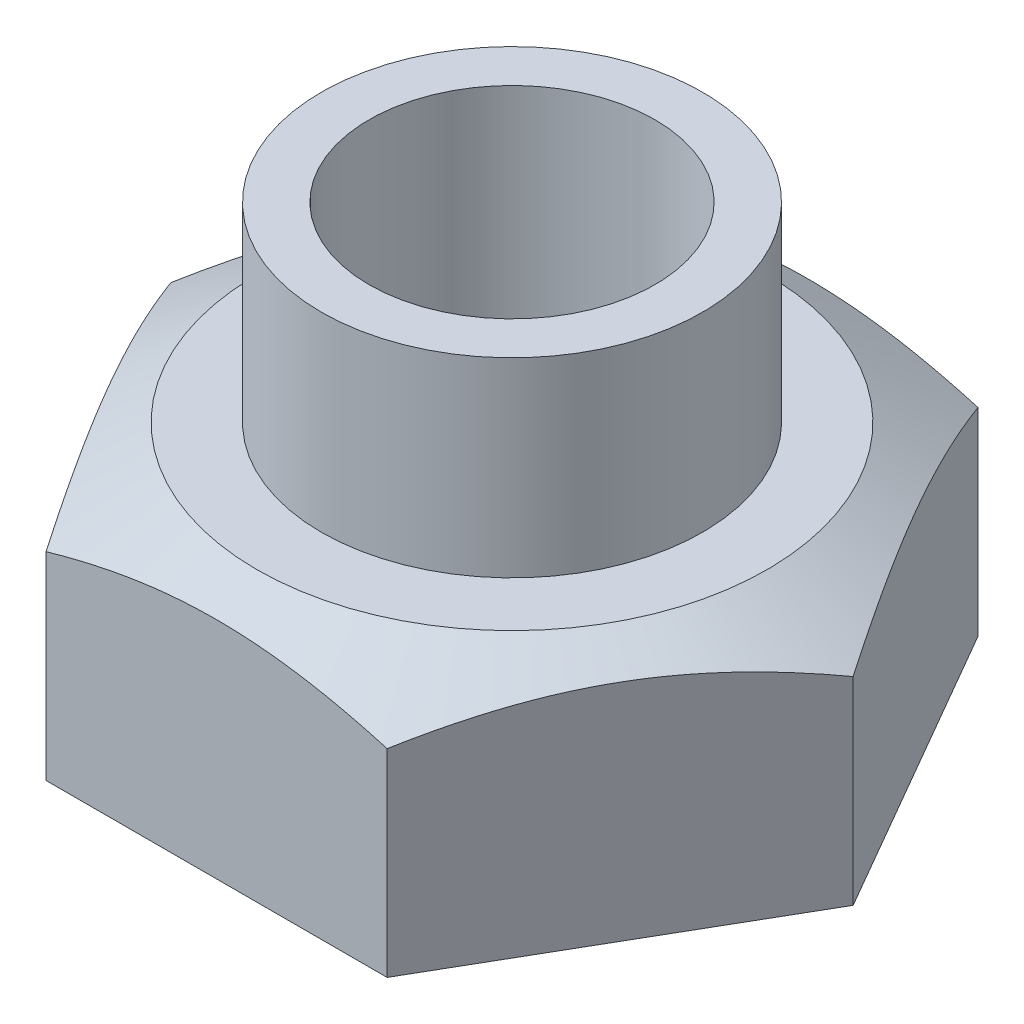
ISO-10303-21;
HEADER;
FILE_DESCRIPTION(('STEP AP214'),'2;1');
FILE_NAME('part.step','',(''),(''),'','','');
FILE_SCHEMA(('AUTOMOTIVE_DESIGN { 1 0 10303 214 1 1 1 1 }'));
ENDSEC;
DATA;
#1=APPLICATION_CONTEXT('core data for automotive mechanical design processes');
#2=APPLICATION_PROTOCOL_DEFINITION('international standard','automotive_design',2000,#1);
#3=PRODUCT_CONTEXT('',#1,'mechanical');
#4=PRODUCT('Part','Part','',(#3));
#5=PRODUCT_RELATED_PRODUCT_CATEGORY('part','',(#4));
#6=PRODUCT_DEFINITION_FORMATION('','',#4);
#7=PRODUCT_DEFINITION_CONTEXT('part definition',#1,'design');
#8=PRODUCT_DEFINITION('design','',#6,#7);
#9=PRODUCT_DEFINITION_SHAPE('','',#8);
#10=(LENGTH_UNIT() NAMED_UNIT(*) SI_UNIT(.MILLI.,.METRE.));
#11=(NAMED_UNIT(*) PLANE_ANGLE_UNIT() SI_UNIT($,.RADIAN.));
#12=(NAMED_UNIT(*) SI_UNIT($,.STERADIAN.) SOLID_ANGLE_UNIT());
#13=UNCERTAINTY_MEASURE_WITH_UNIT(LENGTH_MEASURE(1.E-05),#10,'distance_accuracy_value','');
#14=(GEOMETRIC_REPRESENTATION_CONTEXT(3) GLOBAL_UNCERTAINTY_ASSIGNED_CONTEXT((#13)) GLOBAL_UNIT_ASSIGNED_CONTEXT((#10,
#11,#12)) REPRESENTATION_CONTEXT('',''));
#15=CARTESIAN_POINT('',(0.,0.,0.));
#16=DIRECTION('',(0.,0.,1.));
#17=DIRECTION('',(1.,0.,0.));
#18=AXIS2_PLACEMENT_3D('',#15,#16,#17);
#19=CARTESIAN_POINT('',(-44.744645862196,65.,77.5));
#20=DIRECTION('',(0.,0.,-1.));
#21=DIRECTION('',(-1.,0.,0.));
#22=AXIS2_PLACEMENT_3D('',#19,#20,#21);
#23=PLANE('',#22);
#24=CARTESIAN_POINT('',(-135.175651929084,13.6908332039156,77.5000000000001));
#25=CARTESIAN_POINT('',(-133.560064455864,14.5000187647562,77.5000000000001));
#26=CARTESIAN_POINT('',(-131.943048344693,15.3063579091028,77.5000000000001));
#27=CARTESIAN_POINT('',(-128.705893505913,16.912761227417,77.5000000000001));
#28=CARTESIAN_POINT('',(-127.08575476411,17.7128253727757,77.5000000000001));
#29=CARTESIAN_POINT('',(-123.841998515401,19.3061410048761,77.5000000000001));
#30=CARTESIAN_POINT('',(-122.218380789003,20.0993920449549,77.5000000000001));
#31=CARTESIAN_POINT('',(-118.967481978106,21.6783498272248,77.5000000000001));
#32=CARTESIAN_POINT('',(-117.340200897506,22.4640565774408,77.5000000000001));
#33=CARTESIAN_POINT('',(-114.0783935173,24.0287316707314,77.5000000000001));
#34=CARTESIAN_POINT('',(-112.443859235362,24.8076833804559,77.5));
#35=CARTESIAN_POINT('',(-109.170437915647,26.3563854623794,77.5));
#36=CARTESIAN_POINT('',(-107.531550883413,27.1261358462869,77.5));
#37=CARTESIAN_POINT('',(-104.249056159087,28.6554461420733,77.5));
#38=CARTESIAN_POINT('',(-102.605448537514,29.415006205229,77.5));
#39=CARTESIAN_POINT('',(-99.3130662114841,30.9228328783578,77.5));
#40=CARTESIAN_POINT('',(-97.6642915276657,31.6710995333707,77.5));
#41=CARTESIAN_POINT('',(-94.2862875805359,33.1886886778208,77.5));
#42=CARTESIAN_POINT('',(-92.5567968571205,33.957429690621,77.5));
#43=CARTESIAN_POINT('',(-89.0910598584537,35.4795470348528,77.5));
#44=CARTESIAN_POINT('',(-87.3548135776388,36.2329233536274,77.5));
#45=CARTESIAN_POINT('',(-83.8748380334898,37.7224544301031,77.5));
#46=CARTESIAN_POINT('',(-82.1311083967432,38.4586083163128,77.5));
#47=CARTESIAN_POINT('',(-78.6355633497624,39.9114782114981,77.5));
#48=CARTESIAN_POINT('',(-76.8837479512098,40.6281942485456,77.5));
#49=CARTESIAN_POINT('',(-73.3723631776861,42.0392581332478,77.5));
#50=CARTESIAN_POINT('',(-71.612799199212,42.7336193907867,77.5));
#51=CARTESIAN_POINT('',(-68.0840686605693,44.0975722954334,77.5));
#52=CARTESIAN_POINT('',(-66.3149020369656,44.7671637786835,77.5));
#53=CARTESIAN_POINT('',(-62.7663356227915,46.0782392756286,77.5));
#54=CARTESIAN_POINT('',(-60.9869367296779,46.7197257130881,77.5));
#55=CARTESIAN_POINT('',(-57.4170228677282,47.9708971580574,77.5));
#56=CARTESIAN_POINT('',(-55.6265081481319,48.580582875744,77.5));
#57=CARTESIAN_POINT('',(-51.6174983759592,49.9010043216298,77.5));
#58=CARTESIAN_POINT('',(-49.3959229298081,50.6024409205918,77.5));
#59=CARTESIAN_POINT('',(-44.9336394361458,51.9417869132311,77.5));
#60=CARTESIAN_POINT('',(-42.6929315283788,52.5796967704793,77.5));
#61=CARTESIAN_POINT('',(-38.1917581668546,53.7819624755312,77.5));
#62=CARTESIAN_POINT('',(-35.931292814605,54.3463187009936,77.5));
#63=CARTESIAN_POINT('',(-31.3908544083925,55.3906404868562,77.5));
#64=CARTESIAN_POINT('',(-29.1108814633232,55.8706065180108,77.5));
#65=CARTESIAN_POINT('',(-24.5716297182263,56.7277080753905,77.5));
#66=CARTESIAN_POINT('',(-22.3126590865374,57.1064546172813,77.5));
#67=CARTESIAN_POINT('',(-18.9132238845838,57.597963620405,77.5));
#68=CARTESIAN_POINT('',(-17.7782101825745,57.7490353185732,77.5));
#69=CARTESIAN_POINT('',(-15.5049704306437,58.0245744977216,77.5));
#70=CARTESIAN_POINT('',(-14.366744486752,58.1490428466566,77.5));
#71=CARTESIAN_POINT('',(-12.0879944179053,58.3703867933363,77.5));
#72=CARTESIAN_POINT('',(-10.9474711864051,58.4672715831577,77.5));
#73=CARTESIAN_POINT('',(-8.66436744615596,58.6327347497053,77.5));
#74=CARTESIAN_POINT('',(-7.52178693845105,58.7013131407936,77.5));
#75=CARTESIAN_POINT('',(-5.23525786079968,58.8095980305361,77.5));
#76=CARTESIAN_POINT('',(-4.09130929383261,58.8493045919536,77.5));
#77=CARTESIAN_POINT('',(-1.80276948947445,58.899511966885,77.5));
#78=CARTESIAN_POINT('',(-0.658178251883595,58.9100127713156,77.5));
#79=CARTESIAN_POINT('',(1.63807914160998,58.9016930074525,77.5));
#80=CARTESIAN_POINT('',(2.78974463197028,58.8826880677743,77.5));
#81=CARTESIAN_POINT('',(5.09220871788416,58.8151773976856,77.5));
#82=CARTESIAN_POINT('',(6.24300731294915,58.7666716506609,77.5));
#83=CARTESIAN_POINT('',(8.54301198835419,58.640570279756,77.5));
#84=CARTESIAN_POINT('',(9.69221806016888,58.5629745007451,77.5));
#85=CARTESIAN_POINT('',(11.9883483756476,58.379335025393,77.5));
#86=CARTESIAN_POINT('',(13.1352726185764,58.2732913198871,77.5));
#87=CARTESIAN_POINT('',(15.4266420746052,58.0335549597962,77.5));
#88=CARTESIAN_POINT('',(16.5710862487641,57.8998523832834,77.5));
#89=CARTESIAN_POINT('',(18.8565644081301,57.6058410730192,77.5));
#90=CARTESIAN_POINT('',(19.9975982807852,57.4455314708018,77.5));
#91=CARTESIAN_POINT('',(23.4148224380505,56.9263956601425,77.5));
#92=CARTESIAN_POINT('',(25.6852916356814,56.5293458005397,77.5));
#93=CARTESIAN_POINT('',(30.2472874041784,55.6359044954879,77.5));
#94=CARTESIAN_POINT('',(32.5384957742367,55.1379088700891,77.5));
#95=CARTESIAN_POINT('',(37.1010436949541,54.058360804766,77.5));
#96=CARTESIAN_POINT('',(39.3723831404079,53.4768079226924,77.5));
#97=CARTESIAN_POINT('',(43.8950582010321,52.2410924351065,77.5));
#98=CARTESIAN_POINT('',(46.1463941632139,51.5869310918393,77.5));
#99=CARTESIAN_POINT('',(50.6298645305689,50.216021671111,77.5));
#100=CARTESIAN_POINT('',(52.8619988091931,49.4992731815147,77.5));
#101=CARTESIAN_POINT('',(56.8516597702295,48.1647908653529,77.5));
#102=CARTESIAN_POINT('',(58.6125150041689,47.5569513652792,77.5));
#103=CARTESIAN_POINT('',(62.1236030041361,46.3112567222358,77.5));
#104=CARTESIAN_POINT('',(63.8738355589092,45.6734009845229,77.5));
#105=CARTESIAN_POINT('',(67.3645174608953,44.3711152050854,77.5));
#106=CARTESIAN_POINT('',(69.1049660518075,43.7066831403693,77.5));
#107=CARTESIAN_POINT('',(72.5766935169713,42.3543431681687,77.5));
#108=CARTESIAN_POINT('',(74.3079724450879,41.6664353987637,77.5));
#109=CARTESIAN_POINT('',(77.763051224029,40.2694271750855,77.5));
#110=CARTESIAN_POINT('',(79.4868464561819,39.5603153133072,77.5));
#111=CARTESIAN_POINT('',(82.9267038205684,38.123591467835,77.5));
#112=CARTESIAN_POINT('',(84.642765942868,37.3959794603836,77.5));
#113=CARTESIAN_POINT('',(88.067731378137,35.9243249370392,77.5));
#114=CARTESIAN_POINT('',(89.7766350117806,35.1802831667098,77.5));
#115=CARTESIAN_POINT('',(93.1879657708027,33.677513286317,77.5));
#116=CARTESIAN_POINT('',(94.8903929010009,32.9187851871851,77.5));
#117=CARTESIAN_POINT('',(98.2165933401014,31.420944616853,77.5));
#118=CARTESIAN_POINT('',(99.8406146232044,30.6823823539018,77.5));
#119=CARTESIAN_POINT('',(103.083684433445,29.1944093116932,77.5));
#120=CARTESIAN_POINT('',(104.702732941794,28.4449984915093,77.5));
#121=CARTESIAN_POINT('',(107.936279532827,26.9363715252533,77.5));
#122=CARTESIAN_POINT('',(109.550777553458,26.1771552462487,77.5));
#123=CARTESIAN_POINT('',(112.775573502115,24.6498534387307,77.5));
#124=CARTESIAN_POINT('',(114.385871425103,23.8817678995867,77.5));
#125=CARTESIAN_POINT('',(117.599667929059,22.338957480692,77.5));
#126=CARTESIAN_POINT('',(119.203173554954,21.5642472700917,77.5));
#127=CARTESIAN_POINT('',(122.406639599265,20.0075296472911,77.5));
#128=CARTESIAN_POINT('',(124.006600014081,19.2255222276833,77.5));
#129=CARTESIAN_POINT('',(127.203154622097,17.6549049747704,77.5));
#130=CARTESIAN_POINT('',(128.799749014303,16.8662955463167,77.5));
#131=CARTESIAN_POINT('',(131.989908832517,15.2829901943997,77.5));
#132=CARTESIAN_POINT('',(133.583474271626,14.4882942973338,77.5));
#133=CARTESIAN_POINT('',(135.175651929084,13.6908332039156,77.5));
#134=B_SPLINE_CURVE_WITH_KNOTS('',3,(#24,#25,#26,#27,#28,#29,#30,#31,#32,#33,#34,#35,#36,#37,
#38,#39,#40,#41,#42,#43,#44,#45,#46,#47,#48,#49,#50,#51,#52,#53,#54,#55,#56,#57,#58,#59,#60,#61,
#62,#63,#64,#65,#66,#67,#68,#69,#70,#71,#72,#73,#74,#75,#76,#77,#78,#79,#80,#81,#82,#83,#84,#85,
#86,#87,#88,#89,#90,#91,#92,#93,#94,#95,#96,#97,#98,#99,#100,#101,#102,#103,#104,#105,#106,#107,
#108,#109,#110,#111,#112,#113,#114,#115,#116,#117,#118,#119,#120,#121,#122,#123,#124,#125,#126,
#127,#128,#129,#130,#131,#132,#133),.UNSPECIFIED.,.F.,.F.,(4,2,2,2,2,2,2,2,2,2,2,2,2,2,2,2,2,2,
2,2,2,2,2,2,2,2,2,2,2,2,2,2,2,2,2,2,2,2,2,2,2,2,2,2,2,2,2,2,2,2,2,2,2,2,4),(0.,5.42071487231693,
10.8414544443772,16.2625467247482,21.6836332379474,27.1155694443553,32.5474987379588,
37.97934730442,43.4111742021678,49.0890390798524,54.766908634653,60.44506488295,
66.1232129304476,71.7978888591497,77.4726023204076,83.1468254301395,88.8209217682441,
95.809127796481,102.797282826239,109.785401974123,116.773482138905,123.64263509882,
127.077445044262,130.512142909266,133.945694835874,137.379245020361,140.812787740778,
144.24633152908,147.701416875451,151.156504167658,154.61160988533,158.066716716091,
161.523065135947,164.979526394856,171.891977583262,178.924369847874,185.956799326269,
192.989106570164,200.021460125181,205.609623009762,211.197896665123,216.786596512723,
222.37526349432,227.966993200872,233.558730088567,239.150213749009,244.741693247636,
250.093871159725,255.446069268277,260.798340012821,266.150617173194,271.493129744352,
276.835647739249,282.177840483144,287.520010070722),.UNSPECIFIED.);
#135=CARTESIAN_POINT('',(-44.744645862196,51.984726181375,77.5));
#136=VERTEX_POINT('',#135);
#137=CARTESIAN_POINT('',(44.744645862196,51.984726181375,77.5));
#138=VERTEX_POINT('',#137);
#139=EDGE_CURVE('E90',#136,#138,#134,.T.);
#140=ORIENTED_EDGE('',*,*,#139,.F.);
#141=DIRECTION('',(0.,-1.,0.));
#142=VECTOR('',#141,1.);
#143=CARTESIAN_POINT('',(-44.744645862196,65.,77.5));
#144=LINE('',#143,#142);
#145=CARTESIAN_POINT('',(-44.744645862196,0.,77.5));
#146=VERTEX_POINT('',#145);
#147=EDGE_CURVE('E61',#136,#146,#144,.T.);
#148=ORIENTED_EDGE('',*,*,#147,.T.);
#149=DIRECTION('',(1.,0.,0.));
#150=VECTOR('',#149,1.);
#151=CARTESIAN_POINT('',(-44.744645862196,0.,77.5));
#152=LINE('',#151,#150);
#153=CARTESIAN_POINT('',(44.744645862196,0.,77.5));
#154=VERTEX_POINT('',#153);
#155=EDGE_CURVE('E97',#146,#154,#152,.T.);
#156=ORIENTED_EDGE('',*,*,#155,.T.);
#157=DIRECTION('',(0.,-1.,0.));
#158=VECTOR('',#157,1.);
#159=CARTESIAN_POINT('',(44.744645862196,65.,77.5));
#160=LINE('',#159,#158);
#161=EDGE_CURVE('E41',#138,#154,#160,.T.);
#162=ORIENTED_EDGE('',*,*,#161,.F.);
#163=EDGE_LOOP('',(#140,#148,#156,#162));
#164=FACE_BOUND('',#163,.T.);
#165=ADVANCED_FACE('F37',(#164),#23,.F.);
#166=CARTESIAN_POINT('',(44.744645862196,65.,77.5));
#167=DIRECTION('',(-0.866025403784439,0.,-0.5));
#168=DIRECTION('',(-0.5,0.,0.866025403784439));
#169=AXIS2_PLACEMENT_3D('',#166,#167,#168);
#170=PLANE('',#169);
#171=CARTESIAN_POINT('',(44.7445303921422,51.9846595145793,77.5002));
#172=CARTESIAN_POINT('',(45.7279960714084,52.5524173651889,75.7967874760107));
#173=CARTESIAN_POINT('',(46.7152977890994,53.0944106265279,74.0867307385698));
#174=CARTESIAN_POINT('',(48.697818171747,54.1197064400091,70.6529047087833));
#175=CARTESIAN_POINT('',(49.6930393265456,54.6029896889639,68.9291311039047));
#176=CARTESIAN_POINT('',(51.6933431211192,55.5043785837059,65.4645033011304));
#177=CARTESIAN_POINT('',(52.6984434243951,55.9223285866876,63.7236185091536));
#178=CARTESIAN_POINT('',(54.7155852598617,56.6840473676332,60.2298263640528));
#179=CARTESIAN_POINT('',(55.7276260902012,57.0278235354415,58.4769202265707));
#180=CARTESIAN_POINT('',(57.7327806423409,57.6266019390296,55.0038906652366));
#181=CARTESIAN_POINT('',(58.7257456361899,57.8835843599496,53.2840248457528));
#182=CARTESIAN_POINT('',(60.7162253487491,58.3144830100772,49.8364128521652));
#183=CARTESIAN_POINT('',(61.7137401546679,58.4883976402663,48.1086665270116));
#184=CARTESIAN_POINT('',(63.7104452318793,58.7487695163611,44.6502718855508));
#185=CARTESIAN_POINT('',(64.7096320924226,58.8353306840645,42.9196294768345));
#186=CARTESIAN_POINT('',(66.7089279240159,58.919133971739,39.4567475171543));
#187=CARTESIAN_POINT('',(67.7090368656143,58.916378851978,37.7245080172019));
#188=CARTESIAN_POINT('',(69.5787384981881,58.827790403563,34.4860897945895));
#189=CARTESIAN_POINT('',(70.4484644726867,58.7527596205288,32.9796802180957));
#190=CARTESIAN_POINT('',(72.1858421997678,58.5365737418266,29.9704537228526));
#191=CARTESIAN_POINT('',(73.0534939818868,58.3954195934571,28.4676367529448));
#192=CARTESIAN_POINT('',(74.7863925023642,58.04944152069,25.4661684711171));
#193=CARTESIAN_POINT('',(75.6516363494392,57.8445600255239,23.9675221670468));
#194=CARTESIAN_POINT('',(77.3780114296339,57.374722105295,20.9773528152287));
#195=CARTESIAN_POINT('',(78.2391426801583,57.1097659346997,19.4858297373353));
#196=CARTESIAN_POINT('',(79.9755744726872,56.5174985500187,16.4782416487972));
#197=CARTESIAN_POINT('',(80.8507681824814,56.188939994379,14.962361676969));
#198=CARTESIAN_POINT('',(82.5957991127172,55.4782335448459,11.9398794450213));
#199=CARTESIAN_POINT('',(83.4656355905248,55.0960783883504,10.4332784711819));
#200=CARTESIAN_POINT('',(85.1979124592089,54.283961735472,7.43288692184467));
#201=CARTESIAN_POINT('',(86.0603638725815,53.8540937837219,5.93907725482372));
#202=CARTESIAN_POINT('',(87.7793015932778,52.9508399919308,2.96178978753112));
#203=CARTESIAN_POINT('',(88.6357895089936,52.4774664167337,1.47830920144254));
#204=CARTESIAN_POINT('',(89.4894071944458,51.9846595145793,-0.000200000000003919));
#205=B_SPLINE_CURVE_WITH_KNOTS('',3,(#171,#172,#173,#174,#175,#176,#177,#178,#179,#180,#181,
#182,#183,#184,#185,#186,#187,#188,#189,#190,#191,#192,#193,#194,#195,#196,#197,#198,#199,#200,
#201,#202,#203,#204),.UNSPECIFIED.,.F.,.F.,(4,2,2,2,2,2,2,2,2,2,2,2,2,2,2,2,4),(0.,
6.14186334010198,12.2857406210746,18.4440383881211,24.6017223282421,30.6075512981868,
36.6134958730437,42.6122869023402,48.6108925426759,53.8328424404571,59.0547175296743,
64.2813237872398,69.507907906079,74.8498656297618,80.1925479155233,85.5249345545818,
90.8558225036455),.UNSPECIFIED.);
#206=CARTESIAN_POINT('',(89.489291724392,51.984726181375,0.));
#207=VERTEX_POINT('',#206);
#208=EDGE_CURVE('E93',#138,#207,#205,.T.);
#209=ORIENTED_EDGE('',*,*,#208,.F.);
#210=ORIENTED_EDGE('',*,*,#161,.T.);
#211=DIRECTION('',(0.5,0.,-0.866025403784439));
#212=VECTOR('',#211,1.);
#213=CARTESIAN_POINT('',(44.744645862196,0.,77.5));
#214=LINE('',#213,#212);
#215=CARTESIAN_POINT('',(89.489291724392,0.,0.));
#216=VERTEX_POINT('',#215);
#217=EDGE_CURVE('E128',#154,#216,#214,.T.);
#218=ORIENTED_EDGE('',*,*,#217,.T.);
#219=DIRECTION('',(0.,-1.,0.));
#220=VECTOR('',#219,1.);
#221=CARTESIAN_POINT('',(89.489291724392,65.,0.));
#222=LINE('',#221,#220);
#223=EDGE_CURVE('E104',#207,#216,#222,.T.);
#224=ORIENTED_EDGE('',*,*,#223,.F.);
#225=EDGE_LOOP('',(#209,#210,#218,#224));
#226=FACE_BOUND('',#225,.T.);
#227=ADVANCED_FACE('F101',(#226),#170,.F.);
#228=CARTESIAN_POINT('',(89.489291724392,65.,0.));
#229=DIRECTION('',(-0.866025403784439,0.,0.5));
#230=DIRECTION('',(0.5,0.,0.866025403784439));
#231=AXIS2_PLACEMENT_3D('',#228,#229,#230);
#232=PLANE('',#231);
#233=CARTESIAN_POINT('',(89.4894071944458,51.9846595145793,0.000199999999986567));
#234=CARTESIAN_POINT('',(88.5059415151796,52.552417365189,-1.70321252398936));
#235=CARTESIAN_POINT('',(87.5186397974885,53.094410626528,-3.41326926143028));
#236=CARTESIAN_POINT('',(85.536119414841,54.1197064400091,-6.84709529121669));
#237=CARTESIAN_POINT('',(84.5408982600424,54.6029896889639,-8.57086889609531));
#238=CARTESIAN_POINT('',(82.5405944654688,55.5043785837059,-12.0354966988696));
#239=CARTESIAN_POINT('',(81.5354941621928,55.9223285866876,-13.7763814908464));
#240=CARTESIAN_POINT('',(79.5183523267263,56.6840473676332,-17.2701736359472));
#241=CARTESIAN_POINT('',(78.5063114963868,57.0278235354415,-19.0230797734294));
#242=CARTESIAN_POINT('',(76.5011569442471,57.6266019390296,-22.4961093347634));
#243=CARTESIAN_POINT('',(75.508191950398,57.8835843599496,-24.2159751542473));
#244=CARTESIAN_POINT('',(73.5177122378389,58.3144830100772,-27.6635871478348));
#245=CARTESIAN_POINT('',(72.5201974319201,58.4883976402663,-29.3913334729885));
#246=CARTESIAN_POINT('',(70.5234923547087,58.7487695163611,-32.8497281144492));
#247=CARTESIAN_POINT('',(69.5243054941654,58.8353306840645,-34.5803705231655));
#248=CARTESIAN_POINT('',(67.5250096625721,58.919133971739,-38.0432524828457));
#249=CARTESIAN_POINT('',(66.5249007209737,58.916378851978,-39.7754919827981));
#250=CARTESIAN_POINT('',(64.6551990883998,58.827790403563,-43.0139102054105));
#251=CARTESIAN_POINT('',(63.7854731139013,58.7527596205288,-44.5203197819043));
#252=CARTESIAN_POINT('',(62.0480953868201,58.5365737418266,-47.5295462771474));
#253=CARTESIAN_POINT('',(61.1804436047011,58.3954195934571,-49.0323632470552));
#254=CARTESIAN_POINT('',(59.4475450842238,58.04944152069,-52.0338315288829));
#255=CARTESIAN_POINT('',(58.5823012371488,57.8445600255239,-53.5324778329532));
#256=CARTESIAN_POINT('',(56.8559261569541,57.374722105295,-56.5226471847713));
#257=CARTESIAN_POINT('',(55.9947949064297,57.1097659346997,-58.0141702626647));
#258=CARTESIAN_POINT('',(54.2583631139008,56.5174985500187,-61.0217583512028));
#259=CARTESIAN_POINT('',(53.3831694041066,56.188939994379,-62.537638323031));
#260=CARTESIAN_POINT('',(51.6381384738707,55.4782335448459,-65.5601205549787));
#261=CARTESIAN_POINT('',(50.7683019960632,55.0960783883504,-67.0667215288181));
#262=CARTESIAN_POINT('',(49.0360251273791,54.283961735472,-70.0671130781553));
#263=CARTESIAN_POINT('',(48.1735737140065,53.8540937837219,-71.5609227451763));
#264=CARTESIAN_POINT('',(46.4546359933102,52.9508399919308,-74.5382102124689));
#265=CARTESIAN_POINT('',(45.5981480775944,52.4774664167337,-76.0216907985574));
#266=CARTESIAN_POINT('',(44.7445303921422,51.9846595145793,-77.5002));
#267=B_SPLINE_CURVE_WITH_KNOTS('',3,(#233,#234,#235,#236,#237,#238,#239,#240,#241,#242,#243,
#244,#245,#246,#247,#248,#249,#250,#251,#252,#253,#254,#255,#256,#257,#258,#259,#260,#261,#262,
#263,#264,#265,#266),.UNSPECIFIED.,.F.,.F.,(4,2,2,2,2,2,2,2,2,2,2,2,2,2,2,2,4),(0.,
6.141863340102,12.2857406210746,18.4440383881211,24.6017223282421,30.6075512981868,
36.6134958730437,42.6122869023402,48.6108925426759,53.8328424404571,59.0547175296743,
64.2813237872398,69.507907906079,74.8498656297618,80.1925479155232,85.5249345545818,
90.8558225036454),.UNSPECIFIED.);
#268=CARTESIAN_POINT('',(44.744645862196,51.984726181375,-77.5));
#269=VERTEX_POINT('',#268);
#270=EDGE_CURVE('E105',#207,#269,#267,.T.);
#271=ORIENTED_EDGE('',*,*,#270,.F.);
#272=ORIENTED_EDGE('',*,*,#223,.T.);
#273=DIRECTION('',(-0.5,0.,-0.866025403784439));
#274=VECTOR('',#273,1.);
#275=CARTESIAN_POINT('',(89.489291724392,0.,0.));
#276=LINE('',#275,#274);
#277=CARTESIAN_POINT('',(44.744645862196,0.,-77.5));
#278=VERTEX_POINT('',#277);
#279=EDGE_CURVE('E126',#216,#278,#276,.T.);
#280=ORIENTED_EDGE('',*,*,#279,.T.);
#281=DIRECTION('',(0.,-1.,0.));
#282=VECTOR('',#281,1.);
#283=CARTESIAN_POINT('',(44.744645862196,65.,-77.5));
#284=LINE('',#283,#282);
#285=EDGE_CURVE('E108',#269,#278,#284,.T.);
#286=ORIENTED_EDGE('',*,*,#285,.F.);
#287=EDGE_LOOP('',(#271,#272,#280,#286));
#288=FACE_BOUND('',#287,.T.);
#289=ADVANCED_FACE('F180',(#288),#232,.F.);
#290=CARTESIAN_POINT('',(44.744645862196,65.,-77.5));
#291=DIRECTION('',(0.,0.,1.));
#292=DIRECTION('',(1.,0.,0.));
#293=AXIS2_PLACEMENT_3D('',#290,#291,#292);
#294=PLANE('',#293);
#295=CARTESIAN_POINT('',(135.175651929084,13.6908332039156,-77.5));
#296=CARTESIAN_POINT('',(133.560064455864,14.5000187647562,-77.5));
#297=CARTESIAN_POINT('',(131.943048344693,15.3063579091028,-77.5));
#298=CARTESIAN_POINT('',(128.705893505913,16.912761227417,-77.5));
#299=CARTESIAN_POINT('',(127.08575476411,17.7128253727757,-77.5));
#300=CARTESIAN_POINT('',(123.841998515401,19.3061410048761,-77.5));
#301=CARTESIAN_POINT('',(122.218380789003,20.0993920449549,-77.5));
#302=CARTESIAN_POINT('',(118.967481978106,21.6783498272248,-77.5));
#303=CARTESIAN_POINT('',(117.340200897506,22.4640565774408,-77.5));
#304=CARTESIAN_POINT('',(114.0783935173,24.0287316707314,-77.5));
#305=CARTESIAN_POINT('',(112.443859235362,24.8076833804559,-77.5));
#306=CARTESIAN_POINT('',(109.170437915647,26.3563854623793,-77.5));
#307=CARTESIAN_POINT('',(107.531550883413,27.1261358462868,-77.5));
#308=CARTESIAN_POINT('',(104.249056159087,28.6554461420733,-77.5));
#309=CARTESIAN_POINT('',(102.605448537514,29.415006205229,-77.5));
#310=CARTESIAN_POINT('',(99.3130662114842,30.9228328783578,-77.5));
#311=CARTESIAN_POINT('',(97.6642915276657,31.6710995333707,-77.5));
#312=CARTESIAN_POINT('',(94.286287580536,33.1886886778208,-77.5));
#313=CARTESIAN_POINT('',(92.5567968571205,33.957429690621,-77.5));
#314=CARTESIAN_POINT('',(89.0910598584538,35.4795470348528,-77.5));
#315=CARTESIAN_POINT('',(87.3548135776388,36.2329233536274,-77.5));
#316=CARTESIAN_POINT('',(83.8748380334899,37.7224544301031,-77.5));
#317=CARTESIAN_POINT('',(82.1311083967433,38.4586083163128,-77.5));
#318=CARTESIAN_POINT('',(78.6355633497624,39.9114782114981,-77.5));
#319=CARTESIAN_POINT('',(76.8837479512099,40.6281942485456,-77.5));
#320=CARTESIAN_POINT('',(73.3723631776862,42.0392581332477,-77.5));
#321=CARTESIAN_POINT('',(71.6127991992121,42.7336193907867,-77.5));
#322=CARTESIAN_POINT('',(68.0840686605693,44.0975722954334,-77.5));
#323=CARTESIAN_POINT('',(66.3149020369657,44.7671637786835,-77.5));
#324=CARTESIAN_POINT('',(62.7663356227916,46.0782392756286,-77.5));
#325=CARTESIAN_POINT('',(60.986936729678,46.7197257130881,-77.5));
#326=CARTESIAN_POINT('',(57.4170228677282,47.9708971580574,-77.5));
#327=CARTESIAN_POINT('',(55.6265081481319,48.580582875744,-77.5));
#328=CARTESIAN_POINT('',(51.6174983759593,49.9010043216298,-77.5));
#329=CARTESIAN_POINT('',(49.3959229298082,50.6024409205918,-77.5));
#330=CARTESIAN_POINT('',(44.9336394361459,51.9417869132311,-77.5));
#331=CARTESIAN_POINT('',(42.6929315283788,52.5796967704793,-77.5));
#332=CARTESIAN_POINT('',(38.1917581668546,53.7819624755312,-77.5));
#333=CARTESIAN_POINT('',(35.9312928146051,54.3463187009936,-77.5));
#334=CARTESIAN_POINT('',(31.3908544083926,55.3906404868562,-77.5));
#335=CARTESIAN_POINT('',(29.1108814633233,55.8706065180108,-77.5));
#336=CARTESIAN_POINT('',(24.5716297182264,56.7277080753905,-77.5));
#337=CARTESIAN_POINT('',(22.3126590865375,57.1064546172813,-77.5));
#338=CARTESIAN_POINT('',(18.9132238845839,57.597963620405,-77.5));
#339=CARTESIAN_POINT('',(17.7782101825746,57.7490353185732,-77.5));
#340=CARTESIAN_POINT('',(15.5049704306437,58.0245744977216,-77.5));
#341=CARTESIAN_POINT('',(14.366744486752,58.1490428466566,-77.5));
#342=CARTESIAN_POINT('',(12.0879944179053,58.3703867933364,-77.5));
#343=CARTESIAN_POINT('',(10.9474711864052,58.4672715831577,-77.5));
#344=CARTESIAN_POINT('',(8.66436744615602,58.6327347497053,-77.5));
#345=CARTESIAN_POINT('',(7.52178693845111,58.7013131407936,-77.5));
#346=CARTESIAN_POINT('',(5.23525786079975,58.8095980305361,-77.5));
#347=CARTESIAN_POINT('',(4.09130929383269,58.8493045919536,-77.5));
#348=CARTESIAN_POINT('',(1.80276948947454,58.899511966885,-77.5));
#349=CARTESIAN_POINT('',(0.658178251883685,58.9100127713156,-77.5));
#350=CARTESIAN_POINT('',(-1.63807914160989,58.9016930074526,-77.5));
#351=CARTESIAN_POINT('',(-2.78974463197021,58.8826880677743,-77.5));
#352=CARTESIAN_POINT('',(-5.09220871788408,58.8151773976856,-77.5));
#353=CARTESIAN_POINT('',(-6.24300731294907,58.7666716506609,-77.5));
#354=CARTESIAN_POINT('',(-8.5430119883541,58.640570279756,-77.5));
#355=CARTESIAN_POINT('',(-9.69221806016877,58.5629745007451,-77.5));
#356=CARTESIAN_POINT('',(-11.9883483756475,58.379335025393,-77.5));
#357=CARTESIAN_POINT('',(-13.1352726185763,58.2732913198871,-77.5));
#358=CARTESIAN_POINT('',(-15.4266420746051,58.0335549597962,-77.5));
#359=CARTESIAN_POINT('',(-16.571086248764,57.8998523832835,-77.5));
#360=CARTESIAN_POINT('',(-18.85656440813,57.6058410730192,-77.5));
#361=CARTESIAN_POINT('',(-19.9975982807851,57.4455314708018,-77.5));
#362=CARTESIAN_POINT('',(-23.4148224380503,56.9263956601425,-77.5));
#363=CARTESIAN_POINT('',(-25.6852916356813,56.5293458005397,-77.5));
#364=CARTESIAN_POINT('',(-30.2472874041783,55.635904495488,-77.5));
#365=CARTESIAN_POINT('',(-32.5384957742366,55.1379088700892,-77.5));
#366=CARTESIAN_POINT('',(-37.101043694954,54.058360804766,-77.5));
#367=CARTESIAN_POINT('',(-39.3723831404077,53.4768079226924,-77.5));
#368=CARTESIAN_POINT('',(-43.895058201032,52.2410924351066,-77.5));
#369=CARTESIAN_POINT('',(-46.1463941632137,51.5869310918393,-77.5));
#370=CARTESIAN_POINT('',(-50.6298645305688,50.2160216711111,-77.5));
#371=CARTESIAN_POINT('',(-52.861998809193,49.4992731815148,-77.5));
#372=CARTESIAN_POINT('',(-56.8516597702294,48.1647908653529,-77.5));
#373=CARTESIAN_POINT('',(-58.6125150041688,47.5569513652793,-77.5));
#374=CARTESIAN_POINT('',(-62.123603004136,46.3112567222358,-77.5));
#375=CARTESIAN_POINT('',(-63.8738355589091,45.6734009845229,-77.5));
#376=CARTESIAN_POINT('',(-67.3645174608953,44.3711152050854,-77.5));
#377=CARTESIAN_POINT('',(-69.1049660518075,43.7066831403694,-77.5));
#378=CARTESIAN_POINT('',(-72.5766935169713,42.3543431681687,-77.5));
#379=CARTESIAN_POINT('',(-74.3079724450879,41.6664353987637,-77.5));
#380=CARTESIAN_POINT('',(-77.763051224029,40.2694271750856,-77.5));
#381=CARTESIAN_POINT('',(-79.4868464561819,39.5603153133072,-77.5));
#382=CARTESIAN_POINT('',(-82.9267038205684,38.123591467835,-77.5));
#383=CARTESIAN_POINT('',(-84.642765942868,37.3959794603836,-77.5));
#384=CARTESIAN_POINT('',(-88.067731378137,35.9243249370392,-77.5));
#385=CARTESIAN_POINT('',(-89.7766350117806,35.1802831667098,-77.5));
#386=CARTESIAN_POINT('',(-93.1879657708027,33.677513286317,-77.5));
#387=CARTESIAN_POINT('',(-94.8903929010009,32.9187851871851,-77.5));
#388=CARTESIAN_POINT('',(-98.2165933401014,31.420944616853,-77.5));
#389=CARTESIAN_POINT('',(-99.8406146232044,30.6823823539018,-77.5));
#390=CARTESIAN_POINT('',(-103.083684433445,29.1944093116932,-77.5));
#391=CARTESIAN_POINT('',(-104.702732941794,28.4449984915093,-77.5));
#392=CARTESIAN_POINT('',(-107.936279532828,26.9363715252533,-77.5));
#393=CARTESIAN_POINT('',(-109.550777553458,26.1771552462487,-77.5));
#394=CARTESIAN_POINT('',(-112.775573502115,24.6498534387307,-77.5));
#395=CARTESIAN_POINT('',(-114.385871425103,23.8817678995867,-77.5));
#396=CARTESIAN_POINT('',(-117.599667929059,22.338957480692,-77.5));
#397=CARTESIAN_POINT('',(-119.203173554954,21.5642472700917,-77.5));
#398=CARTESIAN_POINT('',(-122.406639599265,20.007529647291,-77.5));
#399=CARTESIAN_POINT('',(-124.006600014081,19.2255222276833,-77.5));
#400=CARTESIAN_POINT('',(-127.203154622097,17.6549049747704,-77.5));
#401=CARTESIAN_POINT('',(-128.799749014303,16.8662955463166,-77.5));
#402=CARTESIAN_POINT('',(-131.989908832517,15.2829901943997,-77.5));
#403=CARTESIAN_POINT('',(-133.583474271627,14.4882942973338,-77.5));
#404=CARTESIAN_POINT('',(-135.175651929084,13.6908332039155,-77.5));
#405=B_SPLINE_CURVE_WITH_KNOTS('',3,(#295,#296,#297,#298,#299,#300,#301,#302,#303,#304,#305,
#306,#307,#308,#309,#310,#311,#312,#313,#314,#315,#316,#317,#318,#319,#320,#321,#322,#323,#324,
#325,#326,#327,#328,#329,#330,#331,#332,#333,#334,#335,#336,#337,#338,#339,#340,#341,#342,#343,
#344,#345,#346,#347,#348,#349,#350,#351,#352,#353,#354,#355,#356,#357,#358,#359,#360,#361,#362,
#363,#364,#365,#366,#367,#368,#369,#370,#371,#372,#373,#374,#375,#376,#377,#378,#379,#380,#381,
#382,#383,#384,#385,#386,#387,#388,#389,#390,#391,#392,#393,#394,#395,#396,#397,#398,#399,#400,
#401,#402,#403,#404),.UNSPECIFIED.,.F.,.F.,(4,2,2,2,2,2,2,2,2,2,2,2,2,2,2,2,2,2,2,2,2,2,2,2,2,2,
2,2,2,2,2,2,2,2,2,2,2,2,2,2,2,2,2,2,2,2,2,2,2,2,2,2,2,2,4),(0.,5.42071487231694,
10.8414544443772,16.2625467247482,21.6836332379474,27.1155694443553,32.5474987379588,
37.97934730442,43.4111742021678,49.0890390798524,54.766908634653,60.44506488295,
66.1232129304476,71.7978888591497,77.4726023204076,83.1468254301395,88.8209217682441,
95.809127796481,102.797282826239,109.785401974122,116.773482138905,123.64263509882,
127.077445044262,130.512142909266,133.945694835874,137.379245020361,140.812787740778,
144.24633152908,147.701416875451,151.156504167658,154.61160988533,158.066716716091,
161.523065135947,164.979526394856,171.891977583262,178.924369847874,185.956799326269,
192.989106570164,200.021460125181,205.609623009762,211.197896665123,216.786596512723,
222.37526349432,227.966993200872,233.558730088567,239.150213749009,244.741693247636,
250.093871159725,255.446069268277,260.798340012821,266.150617173195,271.493129744352,
276.835647739249,282.177840483144,287.520010070722),.UNSPECIFIED.);
#406=CARTESIAN_POINT('',(-44.744645862196,51.984726181375,-77.5));
#407=VERTEX_POINT('',#406);
#408=EDGE_CURVE('E169',#269,#407,#405,.T.);
#409=ORIENTED_EDGE('',*,*,#408,.F.);
#410=ORIENTED_EDGE('',*,*,#285,.T.);
#411=DIRECTION('',(-1.,0.,0.));
#412=VECTOR('',#411,1.);
#413=CARTESIAN_POINT('',(44.744645862196,0.,-77.5));
#414=LINE('',#413,#412);
#415=CARTESIAN_POINT('',(-44.744645862196,0.,-77.5));
#416=VERTEX_POINT('',#415);
#417=EDGE_CURVE('E123',#278,#416,#414,.T.);
#418=ORIENTED_EDGE('',*,*,#417,.T.);
#419=DIRECTION('',(0.,-1.,0.));
#420=VECTOR('',#419,1.);
#421=CARTESIAN_POINT('',(-44.744645862196,65.,-77.5));
#422=LINE('',#421,#420);
#423=EDGE_CURVE('E111',#407,#416,#422,.T.);
#424=ORIENTED_EDGE('',*,*,#423,.F.);
#425=EDGE_LOOP('',(#409,#410,#418,#424));
#426=FACE_BOUND('',#425,.T.);
#427=ADVANCED_FACE('F183',(#426),#294,.F.);
#428=CARTESIAN_POINT('',(-44.744645862196,65.,-77.5));
#429=DIRECTION('',(0.866025403784439,0.,0.5));
#430=DIRECTION('',(0.5,0.,-0.866025403784439));
#431=AXIS2_PLACEMENT_3D('',#428,#429,#430);
#432=PLANE('',#431);
#433=CARTESIAN_POINT('',(-44.7445303921422,51.9846595145793,-77.5002));
#434=CARTESIAN_POINT('',(-45.7279960714084,52.5524173651889,-75.7967874760106));
#435=CARTESIAN_POINT('',(-46.7152977890994,53.094410626528,-74.0867307385697));
#436=CARTESIAN_POINT('',(-48.697818171747,54.1197064400091,-70.6529047087833));
#437=CARTESIAN_POINT('',(-49.6930393265456,54.6029896889639,-68.9291311039047));
#438=CARTESIAN_POINT('',(-51.6933431211192,55.5043785837059,-65.4645033011304));
#439=CARTESIAN_POINT('',(-52.6984434243952,55.9223285866876,-63.7236185091536));
#440=CARTESIAN_POINT('',(-54.7155852598617,56.6840473676332,-60.2298263640528));
#441=CARTESIAN_POINT('',(-55.7276260902012,57.0278235354415,-58.4769202265706));
#442=CARTESIAN_POINT('',(-57.7327806423409,57.6266019390296,-55.0038906652366));
#443=CARTESIAN_POINT('',(-58.7257456361899,57.8835843599496,-53.2840248457527));
#444=CARTESIAN_POINT('',(-60.7162253487491,58.3144830100772,-49.8364128521652));
#445=CARTESIAN_POINT('',(-61.7137401546679,58.4883976402663,-48.1086665270115));
#446=CARTESIAN_POINT('',(-63.7104452318793,58.7487695163611,-44.6502718855508));
#447=CARTESIAN_POINT('',(-64.7096320924226,58.8353306840645,-42.9196294768345));
#448=CARTESIAN_POINT('',(-66.7089279240159,58.919133971739,-39.4567475171543));
#449=CARTESIAN_POINT('',(-67.7090368656143,58.916378851978,-37.7245080172019));
#450=CARTESIAN_POINT('',(-69.5787384981881,58.827790403563,-34.4860897945895));
#451=CARTESIAN_POINT('',(-70.4484644726867,58.7527596205288,-32.9796802180957));
#452=CARTESIAN_POINT('',(-72.1858421997678,58.5365737418266,-29.9704537228526));
#453=CARTESIAN_POINT('',(-73.0534939818868,58.3954195934571,-28.4676367529448));
#454=CARTESIAN_POINT('',(-74.7863925023642,58.04944152069,-25.4661684711171));
#455=CARTESIAN_POINT('',(-75.6516363494392,57.8445600255239,-23.9675221670468));
#456=CARTESIAN_POINT('',(-77.3780114296339,57.374722105295,-20.9773528152287));
#457=CARTESIAN_POINT('',(-78.2391426801583,57.1097659346997,-19.4858297373353));
#458=CARTESIAN_POINT('',(-79.9755744726872,56.5174985500187,-16.4782416487972));
#459=CARTESIAN_POINT('',(-80.8507681824814,56.188939994379,-14.962361676969));
#460=CARTESIAN_POINT('',(-82.5957991127173,55.4782335448459,-11.9398794450213));
#461=CARTESIAN_POINT('',(-83.4656355905248,55.0960783883504,-10.4332784711819));
#462=CARTESIAN_POINT('',(-85.1979124592089,54.283961735472,-7.43288692184466));
#463=CARTESIAN_POINT('',(-86.0603638725815,53.8540937837219,-5.93907725482371));
#464=CARTESIAN_POINT('',(-87.7793015932778,52.9508399919308,-2.96178978753111));
#465=CARTESIAN_POINT('',(-88.6357895089936,52.4774664167337,-1.47830920144254));
#466=CARTESIAN_POINT('',(-89.4894071944458,51.9846595145793,0.000200000000006323));
#467=B_SPLINE_CURVE_WITH_KNOTS('',3,(#433,#434,#435,#436,#437,#438,#439,#440,#441,#442,#443,
#444,#445,#446,#447,#448,#449,#450,#451,#452,#453,#454,#455,#456,#457,#458,#459,#460,#461,#462,
#463,#464,#465,#466),.UNSPECIFIED.,.F.,.F.,(4,2,2,2,2,2,2,2,2,2,2,2,2,2,2,2,4),(0.,
6.14186334010198,12.2857406210746,18.4440383881211,24.6017223282421,30.6075512981868,
36.6134958730437,42.6122869023402,48.6108925426759,53.8328424404571,59.0547175296743,
64.2813237872398,69.507907906079,74.8498656297618,80.1925479155232,85.5249345545818,
90.8558225036455),.UNSPECIFIED.);
#468=CARTESIAN_POINT('',(-89.489291724392,51.984726181375,0.));
#469=VERTEX_POINT('',#468);
#470=EDGE_CURVE('E53',#407,#469,#467,.T.);
#471=ORIENTED_EDGE('',*,*,#470,.F.);
#472=ORIENTED_EDGE('',*,*,#423,.T.);
#473=DIRECTION('',(-0.5,0.,0.866025403784439));
#474=VECTOR('',#473,1.);
#475=CARTESIAN_POINT('',(-44.744645862196,0.,-77.5));
#476=LINE('',#475,#474);
#477=CARTESIAN_POINT('',(-89.489291724392,0.,0.));
#478=VERTEX_POINT('',#477);
#479=EDGE_CURVE('E120',#416,#478,#476,.T.);
#480=ORIENTED_EDGE('',*,*,#479,.T.);
#481=DIRECTION('',(0.,-1.,0.));
#482=VECTOR('',#481,1.);
#483=CARTESIAN_POINT('',(-89.489291724392,65.,0.));
#484=LINE('',#483,#482);
#485=EDGE_CURVE('E115',#469,#478,#484,.T.);
#486=ORIENTED_EDGE('',*,*,#485,.F.);
#487=EDGE_LOOP('',(#471,#472,#480,#486));
#488=FACE_BOUND('',#487,.T.);
#489=ADVANCED_FACE('F212',(#488),#432,.F.);
#490=CARTESIAN_POINT('',(-89.489291724392,65.,0.));
#491=DIRECTION('',(0.866025403784439,0.,-0.5));
#492=DIRECTION('',(-0.5,0.,-0.866025403784439));
#493=AXIS2_PLACEMENT_3D('',#490,#491,#492);
#494=PLANE('',#493);
#495=CARTESIAN_POINT('',(-89.4894071944458,51.9846595145793,-0.00020000000000146));
#496=CARTESIAN_POINT('',(-88.5059415151796,52.5524173651889,1.70321252398934));
#497=CARTESIAN_POINT('',(-87.5186397974885,53.0944106265279,3.41326926143026));
#498=CARTESIAN_POINT('',(-85.536119414841,54.1197064400091,6.84709529121667));
#499=CARTESIAN_POINT('',(-84.5408982600424,54.6029896889639,8.57086889609528));
#500=CARTESIAN_POINT('',(-82.5405944654688,55.5043785837059,12.0354966988696));
#501=CARTESIAN_POINT('',(-81.5354941621929,55.9223285866876,13.7763814908464));
#502=CARTESIAN_POINT('',(-79.5183523267263,56.6840473676332,17.2701736359472));
#503=CARTESIAN_POINT('',(-78.5063114963868,57.0278235354415,19.0230797734294));
#504=CARTESIAN_POINT('',(-76.5011569442471,57.6266019390296,22.4961093347634));
#505=CARTESIAN_POINT('',(-75.5081919503981,57.8835843599496,24.2159751542472));
#506=CARTESIAN_POINT('',(-73.5177122378389,58.3144830100772,27.6635871478348));
#507=CARTESIAN_POINT('',(-72.5201974319201,58.4883976402663,29.3913334729884));
#508=CARTESIAN_POINT('',(-70.5234923547087,58.7487695163611,32.8497281144492));
#509=CARTESIAN_POINT('',(-69.5243054941654,58.8353306840645,34.5803705231655));
#510=CARTESIAN_POINT('',(-67.5250096625721,58.919133971739,38.0432524828457));
#511=CARTESIAN_POINT('',(-66.5249007209737,58.916378851978,39.7754919827981));
#512=CARTESIAN_POINT('',(-64.6551990883999,58.827790403563,43.0139102054105));
#513=CARTESIAN_POINT('',(-63.7854731139013,58.7527596205288,44.5203197819043));
#514=CARTESIAN_POINT('',(-62.0480953868202,58.5365737418266,47.5295462771474));
#515=CARTESIAN_POINT('',(-61.1804436047012,58.3954195934571,49.0323632470552));
#516=CARTESIAN_POINT('',(-59.4475450842238,58.04944152069,52.0338315288829));
#517=CARTESIAN_POINT('',(-58.5823012371488,57.8445600255239,53.5324778329532));
#518=CARTESIAN_POINT('',(-56.855926156954,57.374722105295,56.5226471847713));
#519=CARTESIAN_POINT('',(-55.9947949064297,57.1097659346997,58.0141702626648));
#520=CARTESIAN_POINT('',(-54.2583631139007,56.5174985500187,61.0217583512029));
#521=CARTESIAN_POINT('',(-53.3831694041066,56.188939994379,62.5376383230311));
#522=CARTESIAN_POINT('',(-51.6381384738707,55.4782335448459,65.5601205549787));
#523=CARTESIAN_POINT('',(-50.7683019960632,55.0960783883504,67.0667215288181));
#524=CARTESIAN_POINT('',(-49.0360251273791,54.283961735472,70.0671130781554));
#525=CARTESIAN_POINT('',(-48.1735737140064,53.8540937837219,71.5609227451763));
#526=CARTESIAN_POINT('',(-46.4546359933102,52.9508399919308,74.5382102124689));
#527=CARTESIAN_POINT('',(-45.5981480775943,52.4774664167337,76.0216907985575));
#528=CARTESIAN_POINT('',(-44.7445303921422,51.9846595145793,77.5002));
#529=B_SPLINE_CURVE_WITH_KNOTS('',3,(#495,#496,#497,#498,#499,#500,#501,#502,#503,#504,#505,
#506,#507,#508,#509,#510,#511,#512,#513,#514,#515,#516,#517,#518,#519,#520,#521,#522,#523,#524,
#525,#526,#527,#528),.UNSPECIFIED.,.F.,.F.,(4,2,2,2,2,2,2,2,2,2,2,2,2,2,2,2,4),(0.,
6.14186334010199,12.2857406210746,18.4440383881211,24.6017223282421,30.6075512981868,
36.6134958730437,42.6122869023402,48.6108925426759,53.8328424404571,59.0547175296744,
64.2813237872398,69.507907906079,74.8498656297619,80.1925479155233,85.5249345545818,
90.8558225036455),.UNSPECIFIED.);
#530=EDGE_CURVE('E95',#469,#136,#529,.T.);
#531=ORIENTED_EDGE('',*,*,#530,.F.);
#532=ORIENTED_EDGE('',*,*,#485,.T.);
#533=DIRECTION('',(0.5,0.,0.866025403784439));
#534=VECTOR('',#533,1.);
#535=CARTESIAN_POINT('',(-89.489291724392,0.,0.));
#536=LINE('',#535,#534);
#537=EDGE_CURVE('E118',#478,#146,#536,.T.);
#538=ORIENTED_EDGE('',*,*,#537,.T.);
#539=ORIENTED_EDGE('',*,*,#147,.F.);
#540=EDGE_LOOP('',(#531,#532,#538,#539));
#541=FACE_BOUND('',#540,.T.);
#542=ADVANCED_FACE('F221',(#541),#494,.F.);
#543=CARTESIAN_POINT('',(0.,0.,0.));
#544=DIRECTION('',(0.,1.,0.));
#545=DIRECTION('',(0.,0.,1.));
#546=AXIS2_PLACEMENT_3D('',#543,#544,#545);
#547=PLANE('',#546);
#548=CARTESIAN_POINT('',(0.,0.,0.));
#549=DIRECTION('',(0.,1.,0.));
#550=DIRECTION('',(0.,0.,1.));
#551=AXIS2_PLACEMENT_3D('',#548,#549,#550);
#552=CIRCLE('',#551,37.5);
#553=CARTESIAN_POINT('',(0.,0.,37.5));
#554=VERTEX_POINT('',#553);
#555=EDGE_CURVE('E294',#554,#554,#552,.T.);
#556=ORIENTED_EDGE('',*,*,#555,.T.);
#557=EDGE_LOOP('',(#556));
#558=FACE_BOUND('',#557,.T.);
#559=ORIENTED_EDGE('',*,*,#155,.F.);
#560=ORIENTED_EDGE('',*,*,#537,.F.);
#561=ORIENTED_EDGE('',*,*,#479,.F.);
#562=ORIENTED_EDGE('',*,*,#417,.F.);
#563=ORIENTED_EDGE('',*,*,#279,.F.);
#564=ORIENTED_EDGE('',*,*,#217,.F.);
#565=EDGE_LOOP('',(#559,#560,#561,#562,#563,#564));
#566=FACE_BOUND('',#565,.T.);
#567=ADVANCED_FACE('F145',(#558,#566),#547,.F.);
#568=CARTESIAN_POINT('',(0.,65.,0.));
#569=DIRECTION('',(0.,-1.,0.));
#570=DIRECTION('',(0.,0.,-1.));
#571=AXIS2_PLACEMENT_3D('',#568,#569,#570);
#572=CONICAL_SURFACE('',#571,66.9461761961128,1.04719755119659);
#573=CARTESIAN_POINT('',(0.,65.,0.));
#574=DIRECTION('',(0.,1.,0.));
#575=DIRECTION('',(0.,0.,1.));
#576=AXIS2_PLACEMENT_3D('',#573,#574,#575);
#577=CIRCLE('',#576,66.9461761961128);
#578=CARTESIAN_POINT('',(0.,65.,66.9461761961128));
#579=VERTEX_POINT('',#578);
#580=EDGE_CURVE('E303',#579,#579,#577,.T.);
#581=ORIENTED_EDGE('',*,*,#580,.F.);
#582=EDGE_LOOP('',(#581));
#583=FACE_BOUND('',#582,.T.);
#584=ORIENTED_EDGE('',*,*,#139,.T.);
#585=ORIENTED_EDGE('',*,*,#208,.T.);
#586=ORIENTED_EDGE('',*,*,#270,.T.);
#587=ORIENTED_EDGE('',*,*,#408,.T.);
#588=ORIENTED_EDGE('',*,*,#470,.T.);
#589=ORIENTED_EDGE('',*,*,#530,.T.);
#590=EDGE_LOOP('',(#584,#585,#586,#587,#588,#589));
#591=FACE_BOUND('',#590,.T.);
#592=ADVANCED_FACE('F92',(#583,#591),#572,.T.);
#593=CARTESIAN_POINT('',(0.,65.,0.));
#594=DIRECTION('',(0.,1.,0.));
#595=DIRECTION('',(0.,0.,1.));
#596=AXIS2_PLACEMENT_3D('',#593,#594,#595);
#597=PLANE('',#596);
#598=CARTESIAN_POINT('',(0.,65.,0.));
#599=DIRECTION('',(0.,1.,0.));
#600=DIRECTION('',(0.,0.,1.));
#601=AXIS2_PLACEMENT_3D('',#598,#599,#600);
#602=CIRCLE('',#601,50.);
#603=CARTESIAN_POINT('',(0.,65.,50.));
#604=VERTEX_POINT('',#603);
#605=EDGE_CURVE('E11',#604,#604,#602,.T.);
#606=ORIENTED_EDGE('',*,*,#605,.F.);
#607=EDGE_LOOP('',(#606));
#608=FACE_BOUND('',#607,.T.);
#609=ORIENTED_EDGE('',*,*,#580,.T.);
#610=EDGE_LOOP('',(#609));
#611=FACE_BOUND('',#610,.T.);
#612=ADVANCED_FACE('F144',(#608,#611),#597,.T.);
#613=CARTESIAN_POINT('',(0.,115.,0.));
#614=DIRECTION('',(0.,-1.,0.));
#615=DIRECTION('',(0.,0.,-1.));
#616=AXIS2_PLACEMENT_3D('',#613,#614,#615);
#617=CYLINDRICAL_SURFACE('',#616,50.);
#618=CARTESIAN_POINT('',(0.,115.,0.));
#619=DIRECTION('',(0.,1.,0.));
#620=DIRECTION('',(0.,0.,1.));
#621=AXIS2_PLACEMENT_3D('',#618,#619,#620);
#622=CIRCLE('',#621,50.);
#623=CARTESIAN_POINT('',(0.,115.,50.));
#624=VERTEX_POINT('',#623);
#625=EDGE_CURVE('E299',#624,#624,#622,.T.);
#626=ORIENTED_EDGE('',*,*,#625,.F.);
#627=EDGE_LOOP('',(#626));
#628=FACE_BOUND('',#627,.T.);
#629=ORIENTED_EDGE('',*,*,#605,.T.);
#630=EDGE_LOOP('',(#629));
#631=FACE_BOUND('',#630,.T.);
#632=ADVANCED_FACE('F147',(#628,#631),#617,.T.);
#633=CARTESIAN_POINT('',(0.,115.,0.));
#634=DIRECTION('',(0.,1.,0.));
#635=DIRECTION('',(0.,0.,1.));
#636=AXIS2_PLACEMENT_3D('',#633,#634,#635);
#637=PLANE('',#636);
#638=CARTESIAN_POINT('',(0.,115.,0.));
#639=DIRECTION('',(0.,1.,0.));
#640=DIRECTION('',(0.,0.,1.));
#641=AXIS2_PLACEMENT_3D('',#638,#639,#640);
#642=CIRCLE('',#641,37.5);
#643=CARTESIAN_POINT('',(0.,115.,37.5));
#644=VERTEX_POINT('',#643);
#645=EDGE_CURVE('E297',#644,#644,#642,.T.);
#646=ORIENTED_EDGE('',*,*,#645,.F.);
#647=EDGE_LOOP('',(#646));
#648=FACE_BOUND('',#647,.T.);
#649=ORIENTED_EDGE('',*,*,#625,.T.);
#650=EDGE_LOOP('',(#649));
#651=FACE_BOUND('',#650,.T.);
#652=ADVANCED_FACE('F256',(#648,#651),#637,.T.);
#653=CARTESIAN_POINT('',(0.,0.,0.));
#654=DIRECTION('',(0.,1.,0.));
#655=DIRECTION('',(0.,0.,1.));
#656=AXIS2_PLACEMENT_3D('',#653,#654,#655);
#657=CYLINDRICAL_SURFACE('',#656,37.5);
#658=ORIENTED_EDGE('',*,*,#555,.F.);
#659=EDGE_LOOP('',(#658));
#660=FACE_BOUND('',#659,.T.);
#661=ORIENTED_EDGE('',*,*,#645,.T.);
#662=EDGE_LOOP('',(#661));
#663=FACE_BOUND('',#662,.T.);
#664=ADVANCED_FACE('F272',(#660,#663),#657,.F.);
#665=CLOSED_SHELL('',(#165,#227,#289,#427,#489,#542,#567,#592,#612,#632,#652,#664));
#666=MANIFOLD_SOLID_BREP('B2',#665);
#667=ADVANCED_BREP_SHAPE_REPRESENTATION('',(#18,#666),#14);
#668=SHAPE_DEFINITION_REPRESENTATION(#9,#667);
ENDSEC;
END-ISO-10303-21;
